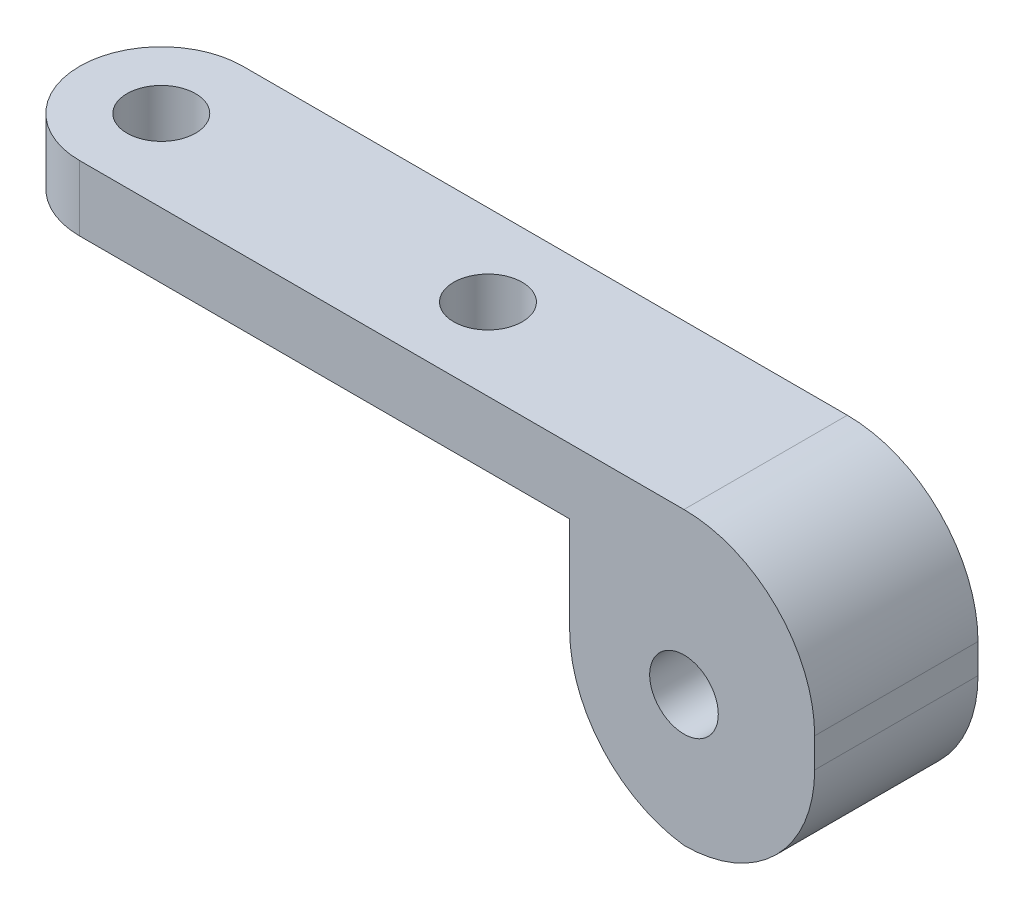
ISO-10303-21;
HEADER;
FILE_DESCRIPTION(('STEP AP214'),'2;1');
FILE_NAME('part.step','',(''),(''),'','','');
FILE_SCHEMA(('AUTOMOTIVE_DESIGN { 1 0 10303 214 1 1 1 1 }'));
ENDSEC;
DATA;
#1=APPLICATION_CONTEXT('core data for automotive mechanical design processes');
#2=APPLICATION_PROTOCOL_DEFINITION('international standard','automotive_design',2000,#1);
#3=PRODUCT_CONTEXT('',#1,'mechanical');
#4=PRODUCT('Part','Part','',(#3));
#5=PRODUCT_RELATED_PRODUCT_CATEGORY('part','',(#4));
#6=PRODUCT_DEFINITION_FORMATION('','',#4);
#7=PRODUCT_DEFINITION_CONTEXT('part definition',#1,'design');
#8=PRODUCT_DEFINITION('design','',#6,#7);
#9=PRODUCT_DEFINITION_SHAPE('','',#8);
#10=(LENGTH_UNIT() NAMED_UNIT(*) SI_UNIT(.MILLI.,.METRE.));
#11=(NAMED_UNIT(*) PLANE_ANGLE_UNIT() SI_UNIT($,.RADIAN.));
#12=(NAMED_UNIT(*) SI_UNIT($,.STERADIAN.) SOLID_ANGLE_UNIT());
#13=UNCERTAINTY_MEASURE_WITH_UNIT(LENGTH_MEASURE(1.E-05),#10,'distance_accuracy_value','');
#14=(GEOMETRIC_REPRESENTATION_CONTEXT(3) GLOBAL_UNCERTAINTY_ASSIGNED_CONTEXT((#13)) GLOBAL_UNIT_ASSIGNED_CONTEXT((#10,
#11,#12)) REPRESENTATION_CONTEXT('',''));
#15=CARTESIAN_POINT('',(0.,0.,0.));
#16=DIRECTION('',(0.,0.,1.));
#17=DIRECTION('',(1.,0.,0.));
#18=AXIS2_PLACEMENT_3D('',#15,#16,#17);
#19=CARTESIAN_POINT('',(0.,2.,0.));
#20=DIRECTION('',(0.,1.,0.));
#21=DIRECTION('',(0.,0.,1.));
#22=AXIS2_PLACEMENT_3D('',#19,#20,#21);
#23=PLANE('',#22);
#24=DIRECTION('',(1.,0.,0.));
#25=VECTOR('',#24,1.);
#26=CARTESIAN_POINT('',(0.,2.,2.5));
#27=LINE('',#26,#25);
#28=CARTESIAN_POINT('',(0.,2.,2.5));
#29=VERTEX_POINT('',#28);
#30=CARTESIAN_POINT('',(18.5,2.,2.5));
#31=VERTEX_POINT('',#30);
#32=EDGE_CURVE('E124',#29,#31,#27,.T.);
#33=ORIENTED_EDGE('',*,*,#32,.T.);
#34=DIRECTION('',(0.,0.,1.));
#35=VECTOR('',#34,1.);
#36=CARTESIAN_POINT('',(18.5,2.,0.));
#37=LINE('',#36,#35);
#38=CARTESIAN_POINT('',(18.5,2.,-2.5));
#39=VERTEX_POINT('',#38);
#40=EDGE_CURVE('E151',#31,#39,#37,.F.);
#41=ORIENTED_EDGE('',*,*,#40,.T.);
#42=DIRECTION('',(-1.,0.,0.));
#43=VECTOR('',#42,1.);
#44=CARTESIAN_POINT('',(0.,2.,-2.5));
#45=LINE('',#44,#43);
#46=CARTESIAN_POINT('',(0.,2.,-2.5));
#47=VERTEX_POINT('',#46);
#48=EDGE_CURVE('E132',#39,#47,#45,.T.);
#49=ORIENTED_EDGE('',*,*,#48,.T.);
#50=CARTESIAN_POINT('',(0.,2.,0.));
#51=DIRECTION('',(0.,1.,0.));
#52=DIRECTION('',(0.,0.,1.));
#53=AXIS2_PLACEMENT_3D('',#50,#51,#52);
#54=CIRCLE('',#53,2.5);
#55=EDGE_CURVE('E120',#47,#29,#54,.T.);
#56=ORIENTED_EDGE('',*,*,#55,.T.);
#57=EDGE_LOOP('',(#33,#41,#49,#56));
#58=FACE_BOUND('',#57,.T.);
#59=CARTESIAN_POINT('',(10.,2.,0.));
#60=DIRECTION('',(0.,1.,0.));
#61=DIRECTION('',(0.,0.,1.));
#62=AXIS2_PLACEMENT_3D('',#59,#60,#61);
#63=CIRCLE('',#62,1.05);
#64=CARTESIAN_POINT('',(10.,2.,1.05));
#65=VERTEX_POINT('',#64);
#66=EDGE_CURVE('E106',#65,#65,#63,.T.);
#67=ORIENTED_EDGE('',*,*,#66,.F.);
#68=EDGE_LOOP('',(#67));
#69=FACE_BOUND('',#68,.T.);
#70=CARTESIAN_POINT('',(0.,2.,0.));
#71=DIRECTION('',(0.,1.,0.));
#72=DIRECTION('',(0.,0.,1.));
#73=AXIS2_PLACEMENT_3D('',#70,#71,#72);
#74=CIRCLE('',#73,1.05);
#75=CARTESIAN_POINT('',(0.,2.,1.05));
#76=VERTEX_POINT('',#75);
#77=EDGE_CURVE('E175',#76,#76,#74,.T.);
#78=ORIENTED_EDGE('',*,*,#77,.F.);
#79=EDGE_LOOP('',(#78));
#80=FACE_BOUND('',#79,.T.);
#81=ADVANCED_FACE('F37',(#58,#69,#80),#23,.T.);
#82=CARTESIAN_POINT('',(0.,0.,0.));
#83=DIRECTION('',(0.,1.,0.));
#84=DIRECTION('',(0.,0.,1.));
#85=AXIS2_PLACEMENT_3D('',#82,#83,#84);
#86=PLANE('',#85);
#87=CARTESIAN_POINT('',(10.,0.,0.));
#88=DIRECTION('',(0.,1.,0.));
#89=DIRECTION('',(0.,0.,1.));
#90=AXIS2_PLACEMENT_3D('',#87,#88,#89);
#91=CIRCLE('',#90,1.05);
#92=CARTESIAN_POINT('',(10.,0.,1.05));
#93=VERTEX_POINT('',#92);
#94=EDGE_CURVE('E169',#93,#93,#91,.T.);
#95=ORIENTED_EDGE('',*,*,#94,.T.);
#96=EDGE_LOOP('',(#95));
#97=FACE_BOUND('',#96,.T.);
#98=DIRECTION('',(-1.,0.,0.));
#99=VECTOR('',#98,1.);
#100=CARTESIAN_POINT('',(0.,0.,-2.5));
#101=LINE('',#100,#99);
#102=CARTESIAN_POINT('',(15.,0.,-2.5));
#103=VERTEX_POINT('',#102);
#104=CARTESIAN_POINT('',(0.,0.,-2.5));
#105=VERTEX_POINT('',#104);
#106=EDGE_CURVE('E110',#103,#105,#101,.T.);
#107=ORIENTED_EDGE('',*,*,#106,.F.);
#108=DIRECTION('',(0.,0.,1.));
#109=VECTOR('',#108,1.);
#110=CARTESIAN_POINT('',(15.,0.,0.));
#111=LINE('',#110,#109);
#112=CARTESIAN_POINT('',(15.,0.,2.5));
#113=VERTEX_POINT('',#112);
#114=EDGE_CURVE('E99',#103,#113,#111,.T.);
#115=ORIENTED_EDGE('',*,*,#114,.T.);
#116=DIRECTION('',(1.,0.,0.));
#117=VECTOR('',#116,1.);
#118=CARTESIAN_POINT('',(0.,0.,2.5));
#119=LINE('',#118,#117);
#120=CARTESIAN_POINT('',(0.,0.,2.5));
#121=VERTEX_POINT('',#120);
#122=EDGE_CURVE('E121',#121,#113,#119,.T.);
#123=ORIENTED_EDGE('',*,*,#122,.F.);
#124=CARTESIAN_POINT('',(0.,0.,0.));
#125=DIRECTION('',(0.,1.,0.));
#126=DIRECTION('',(0.,0.,1.));
#127=AXIS2_PLACEMENT_3D('',#124,#125,#126);
#128=CIRCLE('',#127,2.5);
#129=EDGE_CURVE('E119',#105,#121,#128,.T.);
#130=ORIENTED_EDGE('',*,*,#129,.F.);
#131=EDGE_LOOP('',(#107,#115,#123,#130));
#132=FACE_BOUND('',#131,.T.);
#133=CARTESIAN_POINT('',(0.,0.,0.));
#134=DIRECTION('',(0.,1.,0.));
#135=DIRECTION('',(0.,0.,1.));
#136=AXIS2_PLACEMENT_3D('',#133,#134,#135);
#137=CIRCLE('',#136,1.05);
#138=CARTESIAN_POINT('',(0.,0.,1.05));
#139=VERTEX_POINT('',#138);
#140=EDGE_CURVE('E172',#139,#139,#137,.T.);
#141=ORIENTED_EDGE('',*,*,#140,.T.);
#142=EDGE_LOOP('',(#141));
#143=FACE_BOUND('',#142,.T.);
#144=ADVANCED_FACE('F116',(#97,#132,#143),#86,.F.);
#145=CARTESIAN_POINT('',(0.,2.,0.));
#146=DIRECTION('',(0.,-1.,0.));
#147=DIRECTION('',(0.,0.,-1.));
#148=AXIS2_PLACEMENT_3D('',#145,#146,#147);
#149=CYLINDRICAL_SURFACE('',#148,2.5);
#150=ORIENTED_EDGE('',*,*,#129,.T.);
#151=DIRECTION('',(0.,-1.,0.));
#152=VECTOR('',#151,1.);
#153=CARTESIAN_POINT('',(0.,2.,2.5));
#154=LINE('',#153,#152);
#155=EDGE_CURVE('E131',#29,#121,#154,.T.);
#156=ORIENTED_EDGE('',*,*,#155,.F.);
#157=ORIENTED_EDGE('',*,*,#55,.F.);
#158=DIRECTION('',(0.,-1.,0.));
#159=VECTOR('',#158,1.);
#160=CARTESIAN_POINT('',(0.,2.,-2.5));
#161=LINE('',#160,#159);
#162=EDGE_CURVE('E129',#47,#105,#161,.T.);
#163=ORIENTED_EDGE('',*,*,#162,.T.);
#164=EDGE_LOOP('',(#150,#156,#157,#163));
#165=FACE_BOUND('',#164,.T.);
#166=ADVANCED_FACE('F184',(#165),#149,.T.);
#167=CARTESIAN_POINT('',(0.,2.,2.5));
#168=DIRECTION('',(0.,0.,-1.));
#169=DIRECTION('',(-1.,0.,0.));
#170=AXIS2_PLACEMENT_3D('',#167,#168,#169);
#171=PLANE('',#170);
#172=CARTESIAN_POINT('',(18.5,-2.905,2.5));
#173=DIRECTION('',(0.,0.,1.));
#174=DIRECTION('',(1.,0.,0.));
#175=AXIS2_PLACEMENT_3D('',#172,#173,#174);
#176=CIRCLE('',#175,1.05);
#177=CARTESIAN_POINT('',(19.55,-2.905,2.5));
#178=VERTEX_POINT('',#177);
#179=EDGE_CURVE('E155',#178,#178,#176,.T.);
#180=ORIENTED_EDGE('',*,*,#179,.F.);
#181=EDGE_LOOP('',(#180));
#182=FACE_BOUND('',#181,.T.);
#183=DIRECTION('',(0.,-1.,0.));
#184=VECTOR('',#183,1.);
#185=CARTESIAN_POINT('',(15.,2.,2.5));
#186=LINE('',#185,#184);
#187=CARTESIAN_POINT('',(15.,-2.93637303340311,2.5));
#188=VERTEX_POINT('',#187);
#189=EDGE_CURVE('E102',#113,#188,#186,.T.);
#190=ORIENTED_EDGE('',*,*,#189,.T.);
#191=CARTESIAN_POINT('',(19.,-2.93637303340311,2.5));
#192=DIRECTION('',(0.,0.,-1.));
#193=DIRECTION('',(-1.,0.,0.));
#194=AXIS2_PLACEMENT_3D('',#191,#192,#193);
#195=CIRCLE('',#194,4.);
#196=CARTESIAN_POINT('',(18.5,-6.905,2.5));
#197=VERTEX_POINT('',#196);
#198=EDGE_CURVE('E11',#188,#197,#195,.F.);
#199=ORIENTED_EDGE('',*,*,#198,.T.);
#200=CARTESIAN_POINT('',(18.5,-2.905,2.5));
#201=DIRECTION('',(0.,0.,-1.));
#202=DIRECTION('',(-1.,0.,0.));
#203=AXIS2_PLACEMENT_3D('',#200,#201,#202);
#204=CIRCLE('',#203,4.);
#205=CARTESIAN_POINT('',(22.5,-2.905,2.5));
#206=VERTEX_POINT('',#205);
#207=EDGE_CURVE('E140',#197,#206,#204,.F.);
#208=ORIENTED_EDGE('',*,*,#207,.T.);
#209=DIRECTION('',(0.,-1.,0.));
#210=VECTOR('',#209,1.);
#211=CARTESIAN_POINT('',(22.5,2.,2.5));
#212=LINE('',#211,#210);
#213=CARTESIAN_POINT('',(22.5,-2.,2.5));
#214=VERTEX_POINT('',#213);
#215=EDGE_CURVE('E164',#214,#206,#212,.T.);
#216=ORIENTED_EDGE('',*,*,#215,.F.);
#217=CARTESIAN_POINT('',(18.5,-2.,2.5));
#218=DIRECTION('',(0.,0.,-1.));
#219=DIRECTION('',(-1.,0.,0.));
#220=AXIS2_PLACEMENT_3D('',#217,#218,#219);
#221=CIRCLE('',#220,4.);
#222=EDGE_CURVE('E138',#214,#31,#221,.F.);
#223=ORIENTED_EDGE('',*,*,#222,.T.);
#224=ORIENTED_EDGE('',*,*,#32,.F.);
#225=ORIENTED_EDGE('',*,*,#155,.T.);
#226=ORIENTED_EDGE('',*,*,#122,.T.);
#227=EDGE_LOOP('',(#190,#199,#208,#216,#223,#224,#225,#226));
#228=FACE_BOUND('',#227,.T.);
#229=ADVANCED_FACE('F199',(#182,#228),#171,.F.);
#230=CARTESIAN_POINT('',(0.,2.,-2.5));
#231=DIRECTION('',(0.,0.,1.));
#232=DIRECTION('',(1.,0.,0.));
#233=AXIS2_PLACEMENT_3D('',#230,#231,#232);
#234=PLANE('',#233);
#235=CARTESIAN_POINT('',(18.5,-2.905,-2.5));
#236=DIRECTION('',(0.,0.,1.));
#237=DIRECTION('',(1.,0.,0.));
#238=AXIS2_PLACEMENT_3D('',#235,#236,#237);
#239=CIRCLE('',#238,1.05);
#240=CARTESIAN_POINT('',(19.55,-2.905,-2.5));
#241=VERTEX_POINT('',#240);
#242=EDGE_CURVE('E113',#241,#241,#239,.T.);
#243=ORIENTED_EDGE('',*,*,#242,.T.);
#244=EDGE_LOOP('',(#243));
#245=FACE_BOUND('',#244,.T.);
#246=CARTESIAN_POINT('',(18.5,-2.905,-2.5));
#247=DIRECTION('',(0.,0.,1.));
#248=DIRECTION('',(1.,0.,0.));
#249=AXIS2_PLACEMENT_3D('',#246,#247,#248);
#250=CIRCLE('',#249,4.);
#251=CARTESIAN_POINT('',(22.5,-2.905,-2.5));
#252=VERTEX_POINT('',#251);
#253=CARTESIAN_POINT('',(18.5,-6.905,-2.5));
#254=VERTEX_POINT('',#253);
#255=EDGE_CURVE('E149',#252,#254,#250,.F.);
#256=ORIENTED_EDGE('',*,*,#255,.T.);
#257=CARTESIAN_POINT('',(19.,-2.93637303340311,-2.5));
#258=DIRECTION('',(0.,0.,1.));
#259=DIRECTION('',(1.,0.,0.));
#260=AXIS2_PLACEMENT_3D('',#257,#258,#259);
#261=CIRCLE('',#260,4.);
#262=CARTESIAN_POINT('',(15.,-2.93637303340311,-2.5));
#263=VERTEX_POINT('',#262);
#264=EDGE_CURVE('E59',#254,#263,#261,.F.);
#265=ORIENTED_EDGE('',*,*,#264,.T.);
#266=DIRECTION('',(0.,-1.,0.));
#267=VECTOR('',#266,1.);
#268=CARTESIAN_POINT('',(15.,2.,-2.5));
#269=LINE('',#268,#267);
#270=EDGE_CURVE('E101',#103,#263,#269,.T.);
#271=ORIENTED_EDGE('',*,*,#270,.F.);
#272=ORIENTED_EDGE('',*,*,#106,.T.);
#273=ORIENTED_EDGE('',*,*,#162,.F.);
#274=ORIENTED_EDGE('',*,*,#48,.F.);
#275=CARTESIAN_POINT('',(18.5,-2.,-2.5));
#276=DIRECTION('',(0.,0.,1.));
#277=DIRECTION('',(1.,0.,0.));
#278=AXIS2_PLACEMENT_3D('',#275,#276,#277);
#279=CIRCLE('',#278,4.);
#280=CARTESIAN_POINT('',(22.5,-2.,-2.5));
#281=VERTEX_POINT('',#280);
#282=EDGE_CURVE('E147',#39,#281,#279,.F.);
#283=ORIENTED_EDGE('',*,*,#282,.T.);
#284=DIRECTION('',(0.,-1.,0.));
#285=VECTOR('',#284,1.);
#286=CARTESIAN_POINT('',(22.5,2.,-2.5));
#287=LINE('',#286,#285);
#288=EDGE_CURVE('E112',#281,#252,#287,.T.);
#289=ORIENTED_EDGE('',*,*,#288,.T.);
#290=EDGE_LOOP('',(#256,#265,#271,#272,#273,#274,#283,#289));
#291=FACE_BOUND('',#290,.T.);
#292=ADVANCED_FACE('F108',(#245,#291),#234,.F.);
#293=CARTESIAN_POINT('',(0.,2.,0.));
#294=DIRECTION('',(0.,-1.,0.));
#295=DIRECTION('',(0.,0.,-1.));
#296=AXIS2_PLACEMENT_3D('',#293,#294,#295);
#297=CYLINDRICAL_SURFACE('',#296,1.05);
#298=ORIENTED_EDGE('',*,*,#77,.T.);
#299=EDGE_LOOP('',(#298));
#300=FACE_BOUND('',#299,.T.);
#301=ORIENTED_EDGE('',*,*,#140,.F.);
#302=EDGE_LOOP('',(#301));
#303=FACE_BOUND('',#302,.T.);
#304=ADVANCED_FACE('F222',(#300,#303),#297,.F.);
#305=CARTESIAN_POINT('',(10.,0.,0.));
#306=DIRECTION('',(0.,1.,0.));
#307=DIRECTION('',(0.,0.,1.));
#308=AXIS2_PLACEMENT_3D('',#305,#306,#307);
#309=CYLINDRICAL_SURFACE('',#308,1.05);
#310=ORIENTED_EDGE('',*,*,#94,.F.);
#311=EDGE_LOOP('',(#310));
#312=FACE_BOUND('',#311,.T.);
#313=ORIENTED_EDGE('',*,*,#66,.T.);
#314=EDGE_LOOP('',(#313));
#315=FACE_BOUND('',#314,.T.);
#316=ADVANCED_FACE('F270',(#312,#315),#309,.F.);
#317=CARTESIAN_POINT('',(15.,2.,2.5));
#318=DIRECTION('',(-1.,0.,0.));
#319=DIRECTION('',(0.,0.,1.));
#320=AXIS2_PLACEMENT_3D('',#317,#318,#319);
#321=PLANE('',#320);
#322=ORIENTED_EDGE('',*,*,#270,.T.);
#323=DIRECTION('',(0.,0.,-1.));
#324=VECTOR('',#323,1.);
#325=CARTESIAN_POINT('',(15.,-2.93637303340311,2.5));
#326=LINE('',#325,#324);
#327=EDGE_CURVE('E45',#263,#188,#326,.F.);
#328=ORIENTED_EDGE('',*,*,#327,.T.);
#329=ORIENTED_EDGE('',*,*,#189,.F.);
#330=ORIENTED_EDGE('',*,*,#114,.F.);
#331=EDGE_LOOP('',(#322,#328,#329,#330));
#332=FACE_BOUND('',#331,.T.);
#333=ADVANCED_FACE('F100',(#332),#321,.T.);
#334=CARTESIAN_POINT('',(22.5,2.,2.5));
#335=DIRECTION('',(1.,0.,0.));
#336=DIRECTION('',(0.,0.,-1.));
#337=AXIS2_PLACEMENT_3D('',#334,#335,#336);
#338=PLANE('',#337);
#339=ORIENTED_EDGE('',*,*,#215,.T.);
#340=DIRECTION('',(0.,0.,1.));
#341=VECTOR('',#340,1.);
#342=CARTESIAN_POINT('',(22.5,-2.905,2.5));
#343=LINE('',#342,#341);
#344=EDGE_CURVE('E145',#206,#252,#343,.F.);
#345=ORIENTED_EDGE('',*,*,#344,.T.);
#346=ORIENTED_EDGE('',*,*,#288,.F.);
#347=DIRECTION('',(0.,0.,1.));
#348=VECTOR('',#347,1.);
#349=CARTESIAN_POINT('',(22.5,-2.,2.5));
#350=LINE('',#349,#348);
#351=EDGE_CURVE('E142',#281,#214,#350,.T.);
#352=ORIENTED_EDGE('',*,*,#351,.T.);
#353=EDGE_LOOP('',(#339,#345,#346,#352));
#354=FACE_BOUND('',#353,.T.);
#355=ADVANCED_FACE('F196',(#354),#338,.T.);
#356=CARTESIAN_POINT('',(18.5,-2.905,0.));
#357=DIRECTION('',(0.,0.,1.));
#358=DIRECTION('',(1.,0.,0.));
#359=AXIS2_PLACEMENT_3D('',#356,#357,#358);
#360=CYLINDRICAL_SURFACE('',#359,4.);
#361=ORIENTED_EDGE('',*,*,#255,.F.);
#362=ORIENTED_EDGE('',*,*,#344,.F.);
#363=ORIENTED_EDGE('',*,*,#207,.F.);
#364=DIRECTION('',(0.,0.,1.));
#365=VECTOR('',#364,1.);
#366=CARTESIAN_POINT('',(18.5,-6.905,0.));
#367=LINE('',#366,#365);
#368=EDGE_CURVE('E135',#254,#197,#367,.T.);
#369=ORIENTED_EDGE('',*,*,#368,.F.);
#370=EDGE_LOOP('',(#361,#362,#363,#369));
#371=FACE_BOUND('',#370,.T.);
#372=ADVANCED_FACE('F205',(#371),#360,.T.);
#373=CARTESIAN_POINT('',(18.5,-2.,2.5));
#374=DIRECTION('',(0.,0.,1.));
#375=DIRECTION('',(1.,0.,0.));
#376=AXIS2_PLACEMENT_3D('',#373,#374,#375);
#377=CYLINDRICAL_SURFACE('',#376,4.);
#378=ORIENTED_EDGE('',*,*,#282,.F.);
#379=ORIENTED_EDGE('',*,*,#40,.F.);
#380=ORIENTED_EDGE('',*,*,#222,.F.);
#381=ORIENTED_EDGE('',*,*,#351,.F.);
#382=EDGE_LOOP('',(#378,#379,#380,#381));
#383=FACE_BOUND('',#382,.T.);
#384=ADVANCED_FACE('F193',(#383),#377,.T.);
#385=CARTESIAN_POINT('',(18.5,-2.905,-11.5));
#386=DIRECTION('',(0.,0.,1.));
#387=DIRECTION('',(1.,0.,0.));
#388=AXIS2_PLACEMENT_3D('',#385,#386,#387);
#389=CYLINDRICAL_SURFACE('',#388,1.05);
#390=ORIENTED_EDGE('',*,*,#179,.T.);
#391=EDGE_LOOP('',(#390));
#392=FACE_BOUND('',#391,.T.);
#393=ORIENTED_EDGE('',*,*,#242,.F.);
#394=EDGE_LOOP('',(#393));
#395=FACE_BOUND('',#394,.T.);
#396=ADVANCED_FACE('F208',(#392,#395),#389,.F.);
#397=CARTESIAN_POINT('',(19.,-2.93637303340311,0.));
#398=DIRECTION('',(0.,0.,1.));
#399=DIRECTION('',(1.,0.,0.));
#400=AXIS2_PLACEMENT_3D('',#397,#398,#399);
#401=CYLINDRICAL_SURFACE('',#400,4.);
#402=ORIENTED_EDGE('',*,*,#198,.F.);
#403=ORIENTED_EDGE('',*,*,#327,.F.);
#404=ORIENTED_EDGE('',*,*,#264,.F.);
#405=ORIENTED_EDGE('',*,*,#368,.T.);
#406=EDGE_LOOP('',(#402,#403,#404,#405));
#407=FACE_BOUND('',#406,.T.);
#408=ADVANCED_FACE('F39',(#407),#401,.T.);
#409=CLOSED_SHELL('',(#81,#144,#166,#229,#292,#304,#316,#333,#355,#372,#384,#396,#408));
#410=MANIFOLD_SOLID_BREP('B2',#409);
#411=ADVANCED_BREP_SHAPE_REPRESENTATION('',(#18,#410),#14);
#412=SHAPE_DEFINITION_REPRESENTATION(#9,#411);
ENDSEC;
END-ISO-10303-21;
